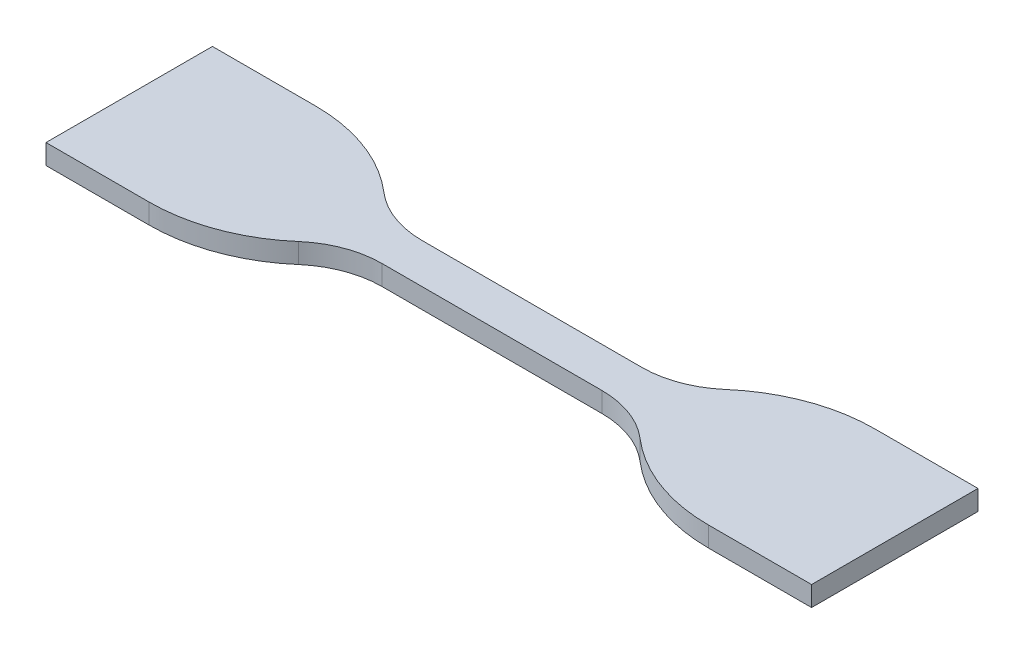
ISO-10303-21;
HEADER;
FILE_DESCRIPTION(('STEP AP214'),'2;1');
FILE_NAME('part.step','',(''),(''),'','','');
FILE_SCHEMA(('AUTOMOTIVE_DESIGN { 1 0 10303 214 1 1 1 1 }'));
ENDSEC;
DATA;
#1=APPLICATION_CONTEXT('core data for automotive mechanical design processes');
#2=APPLICATION_PROTOCOL_DEFINITION('international standard','automotive_design',2000,#1);
#3=PRODUCT_CONTEXT('',#1,'mechanical');
#4=PRODUCT('Part','Part','',(#3));
#5=PRODUCT_RELATED_PRODUCT_CATEGORY('part','',(#4));
#6=PRODUCT_DEFINITION_FORMATION('','',#4);
#7=PRODUCT_DEFINITION_CONTEXT('part definition',#1,'design');
#8=PRODUCT_DEFINITION('design','',#6,#7);
#9=PRODUCT_DEFINITION_SHAPE('','',#8);
#10=(LENGTH_UNIT() NAMED_UNIT(*) SI_UNIT(.MILLI.,.METRE.));
#11=(NAMED_UNIT(*) PLANE_ANGLE_UNIT() SI_UNIT($,.RADIAN.));
#12=(NAMED_UNIT(*) SI_UNIT($,.STERADIAN.) SOLID_ANGLE_UNIT());
#13=UNCERTAINTY_MEASURE_WITH_UNIT(LENGTH_MEASURE(1.E-05),#10,'distance_accuracy_value','');
#14=(GEOMETRIC_REPRESENTATION_CONTEXT(3) GLOBAL_UNCERTAINTY_ASSIGNED_CONTEXT((#13)) GLOBAL_UNIT_ASSIGNED_CONTEXT((#10,
#11,#12)) REPRESENTATION_CONTEXT('',''));
#15=CARTESIAN_POINT('',(0.,0.,0.));
#16=DIRECTION('',(0.,0.,1.));
#17=DIRECTION('',(1.,0.,0.));
#18=AXIS2_PLACEMENT_3D('',#15,#16,#17);
#19=CARTESIAN_POINT('',(28.75,0.75,-6.25));
#20=DIRECTION('',(-1.,0.,0.));
#21=DIRECTION('',(0.,0.,1.));
#22=AXIS2_PLACEMENT_3D('',#19,#20,#21);
#23=PLANE('',#22);
#24=DIRECTION('',(0.,0.,-1.));
#25=VECTOR('',#24,1.);
#26=CARTESIAN_POINT('',(28.75,-0.75,-6.25));
#27=LINE('',#26,#25);
#28=CARTESIAN_POINT('',(28.75,-0.75,6.25));
#29=VERTEX_POINT('',#28);
#30=CARTESIAN_POINT('',(28.75,-0.75,-6.25));
#31=VERTEX_POINT('',#30);
#32=EDGE_CURVE('E261',#29,#31,#27,.T.);
#33=ORIENTED_EDGE('',*,*,#32,.T.);
#34=DIRECTION('',(0.,-1.,0.));
#35=VECTOR('',#34,1.);
#36=CARTESIAN_POINT('',(28.75,0.75,-6.25));
#37=LINE('',#36,#35);
#38=CARTESIAN_POINT('',(28.75,0.75,-6.25));
#39=VERTEX_POINT('',#38);
#40=EDGE_CURVE('E11',#39,#31,#37,.T.);
#41=ORIENTED_EDGE('',*,*,#40,.F.);
#42=DIRECTION('',(0.,0.,-1.));
#43=VECTOR('',#42,1.);
#44=CARTESIAN_POINT('',(28.75,0.75,-6.25));
#45=LINE('',#44,#43);
#46=CARTESIAN_POINT('',(28.75,0.75,6.25));
#47=VERTEX_POINT('',#46);
#48=EDGE_CURVE('E87',#47,#39,#45,.T.);
#49=ORIENTED_EDGE('',*,*,#48,.F.);
#50=DIRECTION('',(0.,-1.,0.));
#51=VECTOR('',#50,1.);
#52=CARTESIAN_POINT('',(28.75,0.75,6.25));
#53=LINE('',#52,#51);
#54=EDGE_CURVE('E243',#47,#29,#53,.T.);
#55=ORIENTED_EDGE('',*,*,#54,.T.);
#56=EDGE_LOOP('',(#33,#41,#49,#55));
#57=FACE_BOUND('',#56,.T.);
#58=ADVANCED_FACE('F40',(#57),#23,.F.);
#59=CARTESIAN_POINT('',(21.0049010188241,0.75,-6.25));
#60=DIRECTION('',(0.,0.,1.));
#61=DIRECTION('',(1.,0.,0.));
#62=AXIS2_PLACEMENT_3D('',#59,#60,#61);
#63=PLANE('',#62);
#64=DIRECTION('',(-1.,0.,0.));
#65=VECTOR('',#64,1.);
#66=CARTESIAN_POINT('',(21.0049010188241,-0.75,-6.25));
#67=LINE('',#66,#65);
#68=CARTESIAN_POINT('',(21.0049010188241,-0.75,-6.25));
#69=VERTEX_POINT('',#68);
#70=EDGE_CURVE('E273',#31,#69,#67,.T.);
#71=ORIENTED_EDGE('',*,*,#70,.T.);
#72=DIRECTION('',(0.,-1.,0.));
#73=VECTOR('',#72,1.);
#74=CARTESIAN_POINT('',(21.0049010188241,0.75,-6.25));
#75=LINE('',#74,#73);
#76=CARTESIAN_POINT('',(21.0049010188241,0.75,-6.25));
#77=VERTEX_POINT('',#76);
#78=EDGE_CURVE('E48',#77,#69,#75,.T.);
#79=ORIENTED_EDGE('',*,*,#78,.F.);
#80=DIRECTION('',(-1.,0.,0.));
#81=VECTOR('',#80,1.);
#82=CARTESIAN_POINT('',(21.0049010188241,0.75,-6.25));
#83=LINE('',#82,#81);
#84=EDGE_CURVE('E263',#39,#77,#83,.T.);
#85=ORIENTED_EDGE('',*,*,#84,.F.);
#86=ORIENTED_EDGE('',*,*,#40,.T.);
#87=EDGE_LOOP('',(#71,#79,#85,#86));
#88=FACE_BOUND('',#87,.T.);
#89=ADVANCED_FACE('F329',(#88),#63,.F.);
#90=CARTESIAN_POINT('',(21.0049010188241,0.75,6.25));
#91=DIRECTION('',(0.,-1.,0.));
#92=DIRECTION('',(0.,0.,-1.));
#93=AXIS2_PLACEMENT_3D('',#90,#91,#92);
#94=CYLINDRICAL_SURFACE('',#93,12.5);
#95=CARTESIAN_POINT('',(21.0049010188241,-0.75,6.25));
#96=DIRECTION('',(0.,1.,0.));
#97=DIRECTION('',(0.,0.,-1.));
#98=AXIS2_PLACEMENT_3D('',#95,#96,#97);
#99=CIRCLE('',#98,12.5);
#100=CARTESIAN_POINT('',(12.8286824170138,-0.75,-3.2051282051282));
#101=VERTEX_POINT('',#100);
#102=EDGE_CURVE('E74',#69,#101,#99,.T.);
#103=ORIENTED_EDGE('',*,*,#102,.T.);
#104=DIRECTION('',(0.,-1.,0.));
#105=VECTOR('',#104,1.);
#106=CARTESIAN_POINT('',(12.8286824170138,0.75,-3.2051282051282));
#107=LINE('',#106,#105);
#108=CARTESIAN_POINT('',(12.8286824170138,0.75,-3.2051282051282));
#109=VERTEX_POINT('',#108);
#110=EDGE_CURVE('E279',#109,#101,#107,.T.);
#111=ORIENTED_EDGE('',*,*,#110,.F.);
#112=CARTESIAN_POINT('',(21.0049010188241,0.75,6.25));
#113=DIRECTION('',(0.,1.,0.));
#114=DIRECTION('',(0.,0.,-1.));
#115=AXIS2_PLACEMENT_3D('',#112,#113,#114);
#116=CIRCLE('',#115,12.5);
#117=EDGE_CURVE('E266',#77,#109,#116,.T.);
#118=ORIENTED_EDGE('',*,*,#117,.F.);
#119=ORIENTED_EDGE('',*,*,#78,.T.);
#120=EDGE_LOOP('',(#103,#111,#118,#119));
#121=FACE_BOUND('',#120,.T.);
#122=ADVANCED_FACE('F282',(#121),#94,.T.);
#123=CARTESIAN_POINT('',(8.25,0.75,-8.5));
#124=DIRECTION('',(0.,-1.,0.));
#125=DIRECTION('',(0.,0.,-1.));
#126=AXIS2_PLACEMENT_3D('',#123,#124,#125);
#127=CYLINDRICAL_SURFACE('',#126,7.);
#128=CARTESIAN_POINT('',(8.25,-0.75,-8.5));
#129=DIRECTION('',(0.,-1.,0.));
#130=DIRECTION('',(0.,0.,1.));
#131=AXIS2_PLACEMENT_3D('',#128,#129,#130);
#132=CIRCLE('',#131,7.);
#133=CARTESIAN_POINT('',(8.25,-0.75,-1.5));
#134=VERTEX_POINT('',#133);
#135=EDGE_CURVE('E80',#101,#134,#132,.T.);
#136=ORIENTED_EDGE('',*,*,#135,.T.);
#137=DIRECTION('',(0.,-1.,0.));
#138=VECTOR('',#137,1.);
#139=CARTESIAN_POINT('',(8.25,0.75,-1.5));
#140=LINE('',#139,#138);
#141=CARTESIAN_POINT('',(8.25,0.75,-1.5));
#142=VERTEX_POINT('',#141);
#143=EDGE_CURVE('E271',#142,#134,#140,.T.);
#144=ORIENTED_EDGE('',*,*,#143,.F.);
#145=CARTESIAN_POINT('',(8.25,0.75,-8.5));
#146=DIRECTION('',(0.,-1.,0.));
#147=DIRECTION('',(0.,0.,1.));
#148=AXIS2_PLACEMENT_3D('',#145,#146,#147);
#149=CIRCLE('',#148,7.);
#150=EDGE_CURVE('E56',#109,#142,#149,.T.);
#151=ORIENTED_EDGE('',*,*,#150,.F.);
#152=ORIENTED_EDGE('',*,*,#110,.T.);
#153=EDGE_LOOP('',(#136,#144,#151,#152));
#154=FACE_BOUND('',#153,.T.);
#155=ADVANCED_FACE('F330',(#154),#127,.F.);
#156=CARTESIAN_POINT('',(0.,0.75,-1.5));
#157=DIRECTION('',(0.,0.,1.));
#158=DIRECTION('',(1.,0.,0.));
#159=AXIS2_PLACEMENT_3D('',#156,#157,#158);
#160=PLANE('',#159);
#161=DIRECTION('',(-1.,0.,0.));
#162=VECTOR('',#161,1.);
#163=CARTESIAN_POINT('',(0.,-0.75,-1.5));
#164=LINE('',#163,#162);
#165=CARTESIAN_POINT('',(-8.25,-0.75,-1.5));
#166=VERTEX_POINT('',#165);
#167=EDGE_CURVE('E264',#134,#166,#164,.T.);
#168=ORIENTED_EDGE('',*,*,#167,.T.);
#169=DIRECTION('',(0.,-1.,0.));
#170=VECTOR('',#169,1.);
#171=CARTESIAN_POINT('',(-8.25,0.75,-1.5));
#172=LINE('',#171,#170);
#173=CARTESIAN_POINT('',(-8.25,0.75,-1.5));
#174=VERTEX_POINT('',#173);
#175=EDGE_CURVE('E227',#174,#166,#172,.T.);
#176=ORIENTED_EDGE('',*,*,#175,.F.);
#177=DIRECTION('',(-1.,0.,0.));
#178=VECTOR('',#177,1.);
#179=CARTESIAN_POINT('',(0.,0.75,-1.5));
#180=LINE('',#179,#178);
#181=EDGE_CURVE('E269',#142,#174,#180,.T.);
#182=ORIENTED_EDGE('',*,*,#181,.F.);
#183=ORIENTED_EDGE('',*,*,#143,.T.);
#184=EDGE_LOOP('',(#168,#176,#182,#183));
#185=FACE_BOUND('',#184,.T.);
#186=ADVANCED_FACE('F292',(#185),#160,.F.);
#187=CARTESIAN_POINT('',(8.25,0.75,-8.5));
#188=DIRECTION('',(0.,1.,0.));
#189=DIRECTION('',(0.,0.,1.));
#190=AXIS2_PLACEMENT_3D('',#187,#188,#189);
#191=PLANE('',#190);
#192=CARTESIAN_POINT('',(-8.25,0.75,8.5));
#193=DIRECTION('',(0.,-1.,0.));
#194=DIRECTION('',(0.,0.,-1.));
#195=AXIS2_PLACEMENT_3D('',#192,#193,#194);
#196=CIRCLE('',#195,7.);
#197=CARTESIAN_POINT('',(-12.8286824170138,0.75,3.2051282051282));
#198=VERTEX_POINT('',#197);
#199=CARTESIAN_POINT('',(-8.25,0.75,1.5));
#200=VERTEX_POINT('',#199);
#201=EDGE_CURVE('E189',#198,#200,#196,.T.);
#202=ORIENTED_EDGE('',*,*,#201,.T.);
#203=DIRECTION('',(-1.,0.,0.));
#204=VECTOR('',#203,1.);
#205=CARTESIAN_POINT('',(0.,0.75,1.5));
#206=LINE('',#205,#204);
#207=CARTESIAN_POINT('',(8.25,0.75,1.5));
#208=VERTEX_POINT('',#207);
#209=EDGE_CURVE('E231',#208,#200,#206,.T.);
#210=ORIENTED_EDGE('',*,*,#209,.F.);
#211=CARTESIAN_POINT('',(8.25,0.75,8.5));
#212=DIRECTION('',(0.,1.,0.));
#213=DIRECTION('',(0.,0.,-1.));
#214=AXIS2_PLACEMENT_3D('',#211,#212,#213);
#215=CIRCLE('',#214,7.);
#216=CARTESIAN_POINT('',(12.8286824170138,0.75,3.2051282051282));
#217=VERTEX_POINT('',#216);
#218=EDGE_CURVE('E233',#217,#208,#215,.T.);
#219=ORIENTED_EDGE('',*,*,#218,.F.);
#220=CARTESIAN_POINT('',(21.0049010188241,0.75,-6.25));
#221=DIRECTION('',(0.,-1.,0.));
#222=DIRECTION('',(0.,0.,1.));
#223=AXIS2_PLACEMENT_3D('',#220,#221,#222);
#224=CIRCLE('',#223,12.5);
#225=CARTESIAN_POINT('',(21.0049010188241,0.75,6.25));
#226=VERTEX_POINT('',#225);
#227=EDGE_CURVE('E237',#226,#217,#224,.T.);
#228=ORIENTED_EDGE('',*,*,#227,.F.);
#229=DIRECTION('',(-1.,0.,0.));
#230=VECTOR('',#229,1.);
#231=CARTESIAN_POINT('',(21.0049010188241,0.75,6.25));
#232=LINE('',#231,#230);
#233=EDGE_CURVE('E240',#47,#226,#232,.T.);
#234=ORIENTED_EDGE('',*,*,#233,.F.);
#235=ORIENTED_EDGE('',*,*,#48,.T.);
#236=ORIENTED_EDGE('',*,*,#84,.T.);
#237=ORIENTED_EDGE('',*,*,#117,.T.);
#238=ORIENTED_EDGE('',*,*,#150,.T.);
#239=ORIENTED_EDGE('',*,*,#181,.T.);
#240=CARTESIAN_POINT('',(-8.25,0.75,-8.5));
#241=DIRECTION('',(0.,1.,0.));
#242=DIRECTION('',(0.,0.,1.));
#243=AXIS2_PLACEMENT_3D('',#240,#241,#242);
#244=CIRCLE('',#243,7.);
#245=CARTESIAN_POINT('',(-12.8286824170138,0.75,-3.2051282051282));
#246=VERTEX_POINT('',#245);
#247=EDGE_CURVE('E206',#246,#174,#244,.T.);
#248=ORIENTED_EDGE('',*,*,#247,.F.);
#249=CARTESIAN_POINT('',(-21.0049010188241,0.75,6.25));
#250=DIRECTION('',(0.,-1.,0.));
#251=DIRECTION('',(0.,0.,-1.));
#252=AXIS2_PLACEMENT_3D('',#249,#250,#251);
#253=CIRCLE('',#252,12.5);
#254=CARTESIAN_POINT('',(-21.0049010188241,0.75,-6.25));
#255=VERTEX_POINT('',#254);
#256=EDGE_CURVE('E209',#255,#246,#253,.T.);
#257=ORIENTED_EDGE('',*,*,#256,.F.);
#258=DIRECTION('',(1.,0.,0.));
#259=VECTOR('',#258,1.);
#260=CARTESIAN_POINT('',(-21.0049010188241,0.75,-6.25));
#261=LINE('',#260,#259);
#262=CARTESIAN_POINT('',(-28.75,0.75,-6.25));
#263=VERTEX_POINT('',#262);
#264=EDGE_CURVE('E169',#263,#255,#261,.T.);
#265=ORIENTED_EDGE('',*,*,#264,.F.);
#266=DIRECTION('',(0.,0.,-1.));
#267=VECTOR('',#266,1.);
#268=CARTESIAN_POINT('',(-28.75,0.75,-6.25));
#269=LINE('',#268,#267);
#270=CARTESIAN_POINT('',(-28.75,0.75,6.25));
#271=VERTEX_POINT('',#270);
#272=EDGE_CURVE('E160',#271,#263,#269,.T.);
#273=ORIENTED_EDGE('',*,*,#272,.F.);
#274=DIRECTION('',(1.,0.,0.));
#275=VECTOR('',#274,1.);
#276=CARTESIAN_POINT('',(-21.0049010188241,0.75,6.25));
#277=LINE('',#276,#275);
#278=CARTESIAN_POINT('',(-21.0049010188241,0.75,6.25));
#279=VERTEX_POINT('',#278);
#280=EDGE_CURVE('E165',#271,#279,#277,.T.);
#281=ORIENTED_EDGE('',*,*,#280,.T.);
#282=CARTESIAN_POINT('',(-21.0049010188241,0.75,-6.25));
#283=DIRECTION('',(0.,1.,0.));
#284=DIRECTION('',(0.,0.,1.));
#285=AXIS2_PLACEMENT_3D('',#282,#283,#284);
#286=CIRCLE('',#285,12.5);
#287=EDGE_CURVE('E186',#279,#198,#286,.T.);
#288=ORIENTED_EDGE('',*,*,#287,.T.);
#289=EDGE_LOOP('',(#202,#210,#219,#228,#234,#235,#236,#237,#238,#239,#248,#257,#265,#273,#281,#288));
#290=FACE_BOUND('',#289,.T.);
#291=ADVANCED_FACE('F163',(#290),#191,.T.);
#292=CARTESIAN_POINT('',(8.25,-0.75,-8.5));
#293=DIRECTION('',(0.,1.,0.));
#294=DIRECTION('',(0.,0.,1.));
#295=AXIS2_PLACEMENT_3D('',#292,#293,#294);
#296=PLANE('',#295);
#297=DIRECTION('',(-1.,0.,0.));
#298=VECTOR('',#297,1.);
#299=CARTESIAN_POINT('',(0.,-0.75,1.5));
#300=LINE('',#299,#298);
#301=CARTESIAN_POINT('',(8.25,-0.75,1.5));
#302=VERTEX_POINT('',#301);
#303=CARTESIAN_POINT('',(-8.25,-0.75,1.5));
#304=VERTEX_POINT('',#303);
#305=EDGE_CURVE('E230',#302,#304,#300,.T.);
#306=ORIENTED_EDGE('',*,*,#305,.T.);
#307=CARTESIAN_POINT('',(-8.25,-0.75,8.5));
#308=DIRECTION('',(0.,-1.,0.));
#309=DIRECTION('',(0.,0.,-1.));
#310=AXIS2_PLACEMENT_3D('',#307,#308,#309);
#311=CIRCLE('',#310,7.);
#312=CARTESIAN_POINT('',(-12.8286824170138,-0.75,3.2051282051282));
#313=VERTEX_POINT('',#312);
#314=EDGE_CURVE('E187',#313,#304,#311,.T.);
#315=ORIENTED_EDGE('',*,*,#314,.F.);
#316=CARTESIAN_POINT('',(-21.0049010188241,-0.75,-6.25));
#317=DIRECTION('',(0.,1.,0.));
#318=DIRECTION('',(0.,0.,1.));
#319=AXIS2_PLACEMENT_3D('',#316,#317,#318);
#320=CIRCLE('',#319,12.5);
#321=CARTESIAN_POINT('',(-21.0049010188241,-0.75,6.25));
#322=VERTEX_POINT('',#321);
#323=EDGE_CURVE('E192',#322,#313,#320,.T.);
#324=ORIENTED_EDGE('',*,*,#323,.F.);
#325=DIRECTION('',(1.,0.,0.));
#326=VECTOR('',#325,1.);
#327=CARTESIAN_POINT('',(-21.0049010188241,-0.75,6.25));
#328=LINE('',#327,#326);
#329=CARTESIAN_POINT('',(-28.75,-0.75,6.25));
#330=VERTEX_POINT('',#329);
#331=EDGE_CURVE('E197',#330,#322,#328,.T.);
#332=ORIENTED_EDGE('',*,*,#331,.F.);
#333=DIRECTION('',(0.,0.,-1.));
#334=VECTOR('',#333,1.);
#335=CARTESIAN_POINT('',(-28.75,-0.75,-6.25));
#336=LINE('',#335,#334);
#337=CARTESIAN_POINT('',(-28.75,-0.75,-6.25));
#338=VERTEX_POINT('',#337);
#339=EDGE_CURVE('E177',#330,#338,#336,.T.);
#340=ORIENTED_EDGE('',*,*,#339,.T.);
#341=DIRECTION('',(1.,0.,0.));
#342=VECTOR('',#341,1.);
#343=CARTESIAN_POINT('',(-21.0049010188241,-0.75,-6.25));
#344=LINE('',#343,#342);
#345=CARTESIAN_POINT('',(-21.0049010188241,-0.75,-6.25));
#346=VERTEX_POINT('',#345);
#347=EDGE_CURVE('E218',#338,#346,#344,.T.);
#348=ORIENTED_EDGE('',*,*,#347,.T.);
#349=CARTESIAN_POINT('',(-21.0049010188241,-0.75,6.25));
#350=DIRECTION('',(0.,-1.,0.));
#351=DIRECTION('',(0.,0.,-1.));
#352=AXIS2_PLACEMENT_3D('',#349,#350,#351);
#353=CIRCLE('',#352,12.5);
#354=CARTESIAN_POINT('',(-12.8286824170138,-0.75,-3.2051282051282));
#355=VERTEX_POINT('',#354);
#356=EDGE_CURVE('E215',#346,#355,#353,.T.);
#357=ORIENTED_EDGE('',*,*,#356,.T.);
#358=CARTESIAN_POINT('',(-8.25,-0.75,-8.5));
#359=DIRECTION('',(0.,1.,0.));
#360=DIRECTION('',(0.,0.,1.));
#361=AXIS2_PLACEMENT_3D('',#358,#359,#360);
#362=CIRCLE('',#361,7.);
#363=EDGE_CURVE('E180',#355,#166,#362,.T.);
#364=ORIENTED_EDGE('',*,*,#363,.T.);
#365=ORIENTED_EDGE('',*,*,#167,.F.);
#366=ORIENTED_EDGE('',*,*,#135,.F.);
#367=ORIENTED_EDGE('',*,*,#102,.F.);
#368=ORIENTED_EDGE('',*,*,#70,.F.);
#369=ORIENTED_EDGE('',*,*,#32,.F.);
#370=DIRECTION('',(-1.,0.,0.));
#371=VECTOR('',#370,1.);
#372=CARTESIAN_POINT('',(21.0049010188241,-0.75,6.25));
#373=LINE('',#372,#371);
#374=CARTESIAN_POINT('',(21.0049010188241,-0.75,6.25));
#375=VERTEX_POINT('',#374);
#376=EDGE_CURVE('E234',#29,#375,#373,.T.);
#377=ORIENTED_EDGE('',*,*,#376,.T.);
#378=CARTESIAN_POINT('',(21.0049010188241,-0.75,-6.25));
#379=DIRECTION('',(0.,-1.,0.));
#380=DIRECTION('',(0.,0.,1.));
#381=AXIS2_PLACEMENT_3D('',#378,#379,#380);
#382=CIRCLE('',#381,12.5);
#383=CARTESIAN_POINT('',(12.8286824170138,-0.75,3.2051282051282));
#384=VERTEX_POINT('',#383);
#385=EDGE_CURVE('E248',#375,#384,#382,.T.);
#386=ORIENTED_EDGE('',*,*,#385,.T.);
#387=CARTESIAN_POINT('',(8.25,-0.75,8.5));
#388=DIRECTION('',(0.,1.,0.));
#389=DIRECTION('',(0.,0.,-1.));
#390=AXIS2_PLACEMENT_3D('',#387,#388,#389);
#391=CIRCLE('',#390,7.);
#392=EDGE_CURVE('E245',#384,#302,#391,.T.);
#393=ORIENTED_EDGE('',*,*,#392,.T.);
#394=EDGE_LOOP('',(#306,#315,#324,#332,#340,#348,#357,#364,#365,#366,#367,#368,#369,#377,#386,#393));
#395=FACE_BOUND('',#394,.T.);
#396=ADVANCED_FACE('F287',(#395),#296,.F.);
#397=CARTESIAN_POINT('',(0.,0.75,1.5));
#398=DIRECTION('',(0.,0.,1.));
#399=DIRECTION('',(1.,0.,0.));
#400=AXIS2_PLACEMENT_3D('',#397,#398,#399);
#401=PLANE('',#400);
#402=ORIENTED_EDGE('',*,*,#305,.F.);
#403=DIRECTION('',(0.,-1.,0.));
#404=VECTOR('',#403,1.);
#405=CARTESIAN_POINT('',(8.25,0.75,1.5));
#406=LINE('',#405,#404);
#407=EDGE_CURVE('E259',#208,#302,#406,.T.);
#408=ORIENTED_EDGE('',*,*,#407,.F.);
#409=ORIENTED_EDGE('',*,*,#209,.T.);
#410=DIRECTION('',(0.,-1.,0.));
#411=VECTOR('',#410,1.);
#412=CARTESIAN_POINT('',(-8.25,0.75,1.5));
#413=LINE('',#412,#411);
#414=EDGE_CURVE('E196',#200,#304,#413,.T.);
#415=ORIENTED_EDGE('',*,*,#414,.T.);
#416=EDGE_LOOP('',(#402,#408,#409,#415));
#417=FACE_BOUND('',#416,.T.);
#418=ADVANCED_FACE('F316',(#417),#401,.T.);
#419=CARTESIAN_POINT('',(8.25,0.75,8.5));
#420=DIRECTION('',(0.,-1.,0.));
#421=DIRECTION('',(0.,0.,-1.));
#422=AXIS2_PLACEMENT_3D('',#419,#420,#421);
#423=CYLINDRICAL_SURFACE('',#422,7.);
#424=ORIENTED_EDGE('',*,*,#392,.F.);
#425=DIRECTION('',(0.,-1.,0.));
#426=VECTOR('',#425,1.);
#427=CARTESIAN_POINT('',(12.8286824170138,0.75,3.2051282051282));
#428=LINE('',#427,#426);
#429=EDGE_CURVE('E257',#217,#384,#428,.T.);
#430=ORIENTED_EDGE('',*,*,#429,.F.);
#431=ORIENTED_EDGE('',*,*,#218,.T.);
#432=ORIENTED_EDGE('',*,*,#407,.T.);
#433=EDGE_LOOP('',(#424,#430,#431,#432));
#434=FACE_BOUND('',#433,.T.);
#435=ADVANCED_FACE('F319',(#434),#423,.F.);
#436=CARTESIAN_POINT('',(21.0049010188241,0.75,-6.25));
#437=DIRECTION('',(0.,-1.,0.));
#438=DIRECTION('',(0.,0.,-1.));
#439=AXIS2_PLACEMENT_3D('',#436,#437,#438);
#440=CYLINDRICAL_SURFACE('',#439,12.5);
#441=ORIENTED_EDGE('',*,*,#385,.F.);
#442=DIRECTION('',(0.,-1.,0.));
#443=VECTOR('',#442,1.);
#444=CARTESIAN_POINT('',(21.0049010188241,0.75,6.25));
#445=LINE('',#444,#443);
#446=EDGE_CURVE('E255',#226,#375,#445,.T.);
#447=ORIENTED_EDGE('',*,*,#446,.F.);
#448=ORIENTED_EDGE('',*,*,#227,.T.);
#449=ORIENTED_EDGE('',*,*,#429,.T.);
#450=EDGE_LOOP('',(#441,#447,#448,#449));
#451=FACE_BOUND('',#450,.T.);
#452=ADVANCED_FACE('F323',(#451),#440,.T.);
#453=CARTESIAN_POINT('',(21.0049010188241,0.75,6.25));
#454=DIRECTION('',(0.,0.,1.));
#455=DIRECTION('',(1.,0.,0.));
#456=AXIS2_PLACEMENT_3D('',#453,#454,#455);
#457=PLANE('',#456);
#458=ORIENTED_EDGE('',*,*,#376,.F.);
#459=ORIENTED_EDGE('',*,*,#54,.F.);
#460=ORIENTED_EDGE('',*,*,#233,.T.);
#461=ORIENTED_EDGE('',*,*,#446,.T.);
#462=EDGE_LOOP('',(#458,#459,#460,#461));
#463=FACE_BOUND('',#462,.T.);
#464=ADVANCED_FACE('F326',(#463),#457,.T.);
#465=CARTESIAN_POINT('',(-8.25,0.75,-8.5));
#466=DIRECTION('',(0.,-1.,0.));
#467=DIRECTION('',(0.,0.,-1.));
#468=AXIS2_PLACEMENT_3D('',#465,#466,#467);
#469=CYLINDRICAL_SURFACE('',#468,7.);
#470=ORIENTED_EDGE('',*,*,#363,.F.);
#471=DIRECTION('',(0.,-1.,0.));
#472=VECTOR('',#471,1.);
#473=CARTESIAN_POINT('',(-12.8286824170138,0.75,-3.2051282051282));
#474=LINE('',#473,#472);
#475=EDGE_CURVE('E225',#246,#355,#474,.T.);
#476=ORIENTED_EDGE('',*,*,#475,.F.);
#477=ORIENTED_EDGE('',*,*,#247,.T.);
#478=ORIENTED_EDGE('',*,*,#175,.T.);
#479=EDGE_LOOP('',(#470,#476,#477,#478));
#480=FACE_BOUND('',#479,.T.);
#481=ADVANCED_FACE('F295',(#480),#469,.F.);
#482=CARTESIAN_POINT('',(-21.0049010188241,0.75,6.25));
#483=DIRECTION('',(0.,-1.,0.));
#484=DIRECTION('',(0.,0.,-1.));
#485=AXIS2_PLACEMENT_3D('',#482,#483,#484);
#486=CYLINDRICAL_SURFACE('',#485,12.5);
#487=ORIENTED_EDGE('',*,*,#356,.F.);
#488=DIRECTION('',(0.,-1.,0.));
#489=VECTOR('',#488,1.);
#490=CARTESIAN_POINT('',(-21.0049010188241,0.75,-6.25));
#491=LINE('',#490,#489);
#492=EDGE_CURVE('E223',#255,#346,#491,.T.);
#493=ORIENTED_EDGE('',*,*,#492,.F.);
#494=ORIENTED_EDGE('',*,*,#256,.T.);
#495=ORIENTED_EDGE('',*,*,#475,.T.);
#496=EDGE_LOOP('',(#487,#493,#494,#495));
#497=FACE_BOUND('',#496,.T.);
#498=ADVANCED_FACE('F299',(#497),#486,.T.);
#499=CARTESIAN_POINT('',(-21.0049010188241,0.75,-6.25));
#500=DIRECTION('',(0.,0.,-1.));
#501=DIRECTION('',(-1.,0.,0.));
#502=AXIS2_PLACEMENT_3D('',#499,#500,#501);
#503=PLANE('',#502);
#504=ORIENTED_EDGE('',*,*,#347,.F.);
#505=DIRECTION('',(0.,-1.,0.));
#506=VECTOR('',#505,1.);
#507=CARTESIAN_POINT('',(-28.75,0.75,-6.25));
#508=LINE('',#507,#506);
#509=EDGE_CURVE('E171',#263,#338,#508,.T.);
#510=ORIENTED_EDGE('',*,*,#509,.F.);
#511=ORIENTED_EDGE('',*,*,#264,.T.);
#512=ORIENTED_EDGE('',*,*,#492,.T.);
#513=EDGE_LOOP('',(#504,#510,#511,#512));
#514=FACE_BOUND('',#513,.T.);
#515=ADVANCED_FACE('F302',(#514),#503,.T.);
#516=CARTESIAN_POINT('',(-28.75,0.75,-6.25));
#517=DIRECTION('',(-1.,0.,0.));
#518=DIRECTION('',(0.,0.,1.));
#519=AXIS2_PLACEMENT_3D('',#516,#517,#518);
#520=PLANE('',#519);
#521=ORIENTED_EDGE('',*,*,#339,.F.);
#522=DIRECTION('',(0.,-1.,0.));
#523=VECTOR('',#522,1.);
#524=CARTESIAN_POINT('',(-28.75,0.75,6.25));
#525=LINE('',#524,#523);
#526=EDGE_CURVE('E174',#271,#330,#525,.T.);
#527=ORIENTED_EDGE('',*,*,#526,.F.);
#528=ORIENTED_EDGE('',*,*,#272,.T.);
#529=ORIENTED_EDGE('',*,*,#509,.T.);
#530=EDGE_LOOP('',(#521,#527,#528,#529));
#531=FACE_BOUND('',#530,.T.);
#532=ADVANCED_FACE('F175',(#531),#520,.T.);
#533=CARTESIAN_POINT('',(-21.0049010188241,0.75,6.25));
#534=DIRECTION('',(0.,0.,-1.));
#535=DIRECTION('',(-1.,0.,0.));
#536=AXIS2_PLACEMENT_3D('',#533,#534,#535);
#537=PLANE('',#536);
#538=ORIENTED_EDGE('',*,*,#331,.T.);
#539=DIRECTION('',(0.,-1.,0.));
#540=VECTOR('',#539,1.);
#541=CARTESIAN_POINT('',(-21.0049010188241,0.75,6.25));
#542=LINE('',#541,#540);
#543=EDGE_CURVE('E181',#279,#322,#542,.T.);
#544=ORIENTED_EDGE('',*,*,#543,.F.);
#545=ORIENTED_EDGE('',*,*,#280,.F.);
#546=ORIENTED_EDGE('',*,*,#526,.T.);
#547=EDGE_LOOP('',(#538,#544,#545,#546));
#548=FACE_BOUND('',#547,.T.);
#549=ADVANCED_FACE('F183',(#548),#537,.F.);
#550=CARTESIAN_POINT('',(-21.0049010188241,0.75,-6.25));
#551=DIRECTION('',(0.,-1.,0.));
#552=DIRECTION('',(0.,0.,-1.));
#553=AXIS2_PLACEMENT_3D('',#550,#551,#552);
#554=CYLINDRICAL_SURFACE('',#553,12.5);
#555=ORIENTED_EDGE('',*,*,#323,.T.);
#556=DIRECTION('',(0.,-1.,0.));
#557=VECTOR('',#556,1.);
#558=CARTESIAN_POINT('',(-12.8286824170138,0.75,3.2051282051282));
#559=LINE('',#558,#557);
#560=EDGE_CURVE('E202',#198,#313,#559,.T.);
#561=ORIENTED_EDGE('',*,*,#560,.F.);
#562=ORIENTED_EDGE('',*,*,#287,.F.);
#563=ORIENTED_EDGE('',*,*,#543,.T.);
#564=EDGE_LOOP('',(#555,#561,#562,#563));
#565=FACE_BOUND('',#564,.T.);
#566=ADVANCED_FACE('F306',(#565),#554,.T.);
#567=CARTESIAN_POINT('',(-8.25,0.75,8.5));
#568=DIRECTION('',(0.,-1.,0.));
#569=DIRECTION('',(0.,0.,-1.));
#570=AXIS2_PLACEMENT_3D('',#567,#568,#569);
#571=CYLINDRICAL_SURFACE('',#570,7.);
#572=ORIENTED_EDGE('',*,*,#314,.T.);
#573=ORIENTED_EDGE('',*,*,#414,.F.);
#574=ORIENTED_EDGE('',*,*,#201,.F.);
#575=ORIENTED_EDGE('',*,*,#560,.T.);
#576=EDGE_LOOP('',(#572,#573,#574,#575));
#577=FACE_BOUND('',#576,.T.);
#578=ADVANCED_FACE('F313',(#577),#571,.F.);
#579=CLOSED_SHELL('',(#58,#89,#122,#155,#186,#291,#396,#418,#435,#452,#464,#481,#498,#515,#532,
#549,#566,#578));
#580=MANIFOLD_SOLID_BREP('B2',#579);
#581=ADVANCED_BREP_SHAPE_REPRESENTATION('',(#18,#580),#14);
#582=SHAPE_DEFINITION_REPRESENTATION(#9,#581);
ENDSEC;
END-ISO-10303-21;
